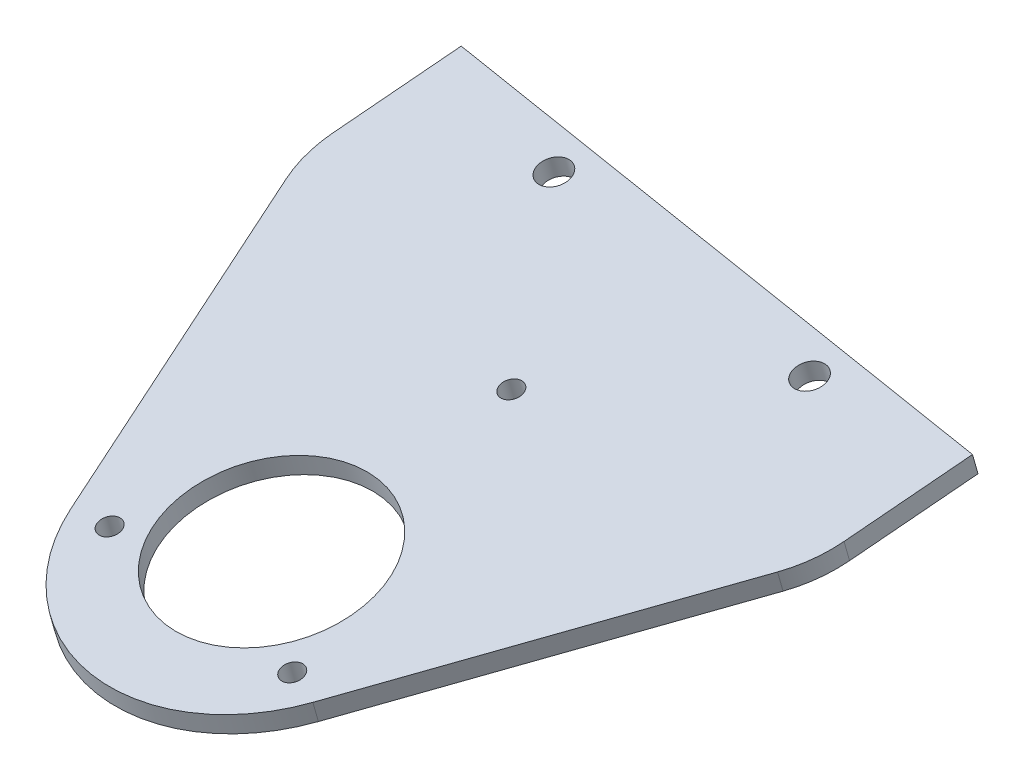
ISO-10303-21;
HEADER;
FILE_DESCRIPTION(('STEP AP214'),'2;1');
FILE_NAME('part.step','',(''),(''),'','','');
FILE_SCHEMA(('AUTOMOTIVE_DESIGN { 1 0 10303 214 1 1 1 1 }'));
ENDSEC;
DATA;
#1=APPLICATION_CONTEXT('core data for automotive mechanical design processes');
#2=APPLICATION_PROTOCOL_DEFINITION('international standard','automotive_design',2000,#1);
#3=PRODUCT_CONTEXT('',#1,'mechanical');
#4=PRODUCT('Part','Part','',(#3));
#5=PRODUCT_RELATED_PRODUCT_CATEGORY('part','',(#4));
#6=PRODUCT_DEFINITION_FORMATION('','',#4);
#7=PRODUCT_DEFINITION_CONTEXT('part definition',#1,'design');
#8=PRODUCT_DEFINITION('design','',#6,#7);
#9=PRODUCT_DEFINITION_SHAPE('','',#8);
#10=(LENGTH_UNIT() NAMED_UNIT(*) SI_UNIT(.MILLI.,.METRE.));
#11=(NAMED_UNIT(*) PLANE_ANGLE_UNIT() SI_UNIT($,.RADIAN.));
#12=(NAMED_UNIT(*) SI_UNIT($,.STERADIAN.) SOLID_ANGLE_UNIT());
#13=UNCERTAINTY_MEASURE_WITH_UNIT(LENGTH_MEASURE(1.E-05),#10,'distance_accuracy_value','');
#14=(GEOMETRIC_REPRESENTATION_CONTEXT(3) GLOBAL_UNCERTAINTY_ASSIGNED_CONTEXT((#13)) GLOBAL_UNIT_ASSIGNED_CONTEXT((#10,
#11,#12)) REPRESENTATION_CONTEXT('',''));
#15=CARTESIAN_POINT('',(0.,0.,0.));
#16=DIRECTION('',(0.,0.,1.));
#17=DIRECTION('',(1.,0.,0.));
#18=AXIS2_PLACEMENT_3D('',#15,#16,#17);
#19=CARTESIAN_POINT('',(-26.0581977589474,77.1039336245992,16.9247151772936));
#20=DIRECTION('',(-0.153827327877701,-0.249366025115355,0.95611387329971));
#21=DIRECTION('',(0.987303474445343,0.,0.158845363004883));
#22=AXIS2_PLACEMENT_3D('',#19,#20,#21);
#23=PLANE('',#22);
#24=DIRECTION('',(-0.987303474445343,0.,-0.158845363004883));
#25=VECTOR('',#24,1.);
#26=CARTESIAN_POINT('',(-26.1839615307256,80.1786331737241,17.7063999963345));
#27=LINE('',#26,#25);
#28=CARTESIAN_POINT('',(-26.1839615307256,80.1786331737241,17.7063999963345));
#29=VERTEX_POINT('',#28);
#30=CARTESIAN_POINT('',(-126.493994534372,80.1786331737242,1.56771111503845));
#31=VERTEX_POINT('',#30);
#32=EDGE_CURVE('E38',#29,#31,#27,.T.);
#33=ORIENTED_EDGE('',*,*,#32,.F.);
#34=DIRECTION('',(-0.0396106367805327,0.968409306811004,0.246199943005015));
#35=VECTOR('',#34,1.);
#36=CARTESIAN_POINT('',(-26.0581977589474,77.1039336245992,16.9247151772936));
#37=LINE('',#36,#35);
#38=CARTESIAN_POINT('',(-26.0581977589474,77.1039336245992,16.9247151772936));
#39=VERTEX_POINT('',#38);
#40=EDGE_CURVE('E169',#39,#29,#37,.T.);
#41=ORIENTED_EDGE('',*,*,#40,.F.);
#42=DIRECTION('',(-0.987303474445343,0.,-0.158845363004883));
#43=VECTOR('',#42,1.);
#44=CARTESIAN_POINT('',(-26.0581977589474,77.1039336245992,16.9247151772936));
#45=LINE('',#44,#43);
#46=CARTESIAN_POINT('',(-126.368230762594,77.1039336245993,0.786026295997527));
#47=VERTEX_POINT('',#46);
#48=EDGE_CURVE('E114',#39,#47,#45,.T.);
#49=ORIENTED_EDGE('',*,*,#48,.T.);
#50=DIRECTION('',(-0.0396106367805327,0.968409306811004,0.246199943005015));
#51=VECTOR('',#50,1.);
#52=CARTESIAN_POINT('',(-126.368230762594,77.1039336245993,0.786026295997527));
#53=LINE('',#52,#51);
#54=EDGE_CURVE('E126',#47,#31,#53,.T.);
#55=ORIENTED_EDGE('',*,*,#54,.T.);
#56=EDGE_LOOP('',(#33,#41,#49,#55));
#57=FACE_BOUND('',#56,.T.);
#58=ADVANCED_FACE('F34',(#57),#23,.F.);
#59=CARTESIAN_POINT('',(-126.368230762594,77.1039336245993,0.786026295997527));
#60=DIRECTION('',(0.987303474445343,0.,0.158845363004883));
#61=DIRECTION('',(-0.0396106367805327,0.968409306811004,0.246199943005015));
#62=AXIS2_PLACEMENT_3D('',#59,#60,#61);
#63=PLANE('',#62);
#64=DIRECTION('',(-0.153827327877701,-0.249366025115355,0.95611387329971));
#65=VECTOR('',#64,1.);
#66=CARTESIAN_POINT('',(-128.447601598419,77.0116846547592,13.7103573059448));
#67=LINE('',#66,#65);
#68=CARTESIAN_POINT('',(-129.424405130443,75.4282103952767,19.7816804013979));
#69=VERTEX_POINT('',#68);
#70=EDGE_CURVE('E51',#31,#69,#67,.T.);
#71=ORIENTED_EDGE('',*,*,#70,.F.);
#72=ORIENTED_EDGE('',*,*,#54,.F.);
#73=DIRECTION('',(0.153827327877701,0.249366025115355,-0.95611387329971));
#74=VECTOR('',#73,1.);
#75=CARTESIAN_POINT('',(-138.480594559684,57.4688528070162,76.0704326796167));
#76=LINE('',#75,#74);
#77=CARTESIAN_POINT('',(-129.298641358664,72.3535108461517,18.999995582357));
#78=VERTEX_POINT('',#77);
#79=EDGE_CURVE('E119',#78,#47,#76,.T.);
#80=ORIENTED_EDGE('',*,*,#79,.F.);
#81=DIRECTION('',(0.0396106367805327,-0.968409306811004,-0.246199943005015));
#82=VECTOR('',#81,1.);
#83=CARTESIAN_POINT('',(-133.574609599123,176.8932955164,45.5772794297483));
#84=LINE('',#83,#82);
#85=EDGE_CURVE('E104',#69,#78,#84,.T.);
#86=ORIENTED_EDGE('',*,*,#85,.F.);
#87=EDGE_LOOP('',(#71,#72,#80,#86));
#88=FACE_BOUND('',#87,.T.);
#89=ADVANCED_FACE('F125',(#88),#63,.F.);
#90=CARTESIAN_POINT('',(-114.766478410939,176.8932955164,48.6032835949914));
#91=DIRECTION('',(0.0396106367805327,-0.968409306811004,-0.246199943005015));
#92=DIRECTION('',(0.153827327877701,0.249366025115355,-0.95611387329971));
#93=AXIS2_PLACEMENT_3D('',#90,#91,#92);
#94=CYLINDRICAL_SURFACE('',#93,19.05);
#95=CARTESIAN_POINT('',(-110.616273942259,75.4282103952767,22.8076845666409));
#96=DIRECTION('',(0.0396106367805327,-0.968409306811004,-0.246199943005015));
#97=DIRECTION('',(0.153827327877701,0.249366025115355,-0.95611387329971));
#98=AXIS2_PLACEMENT_3D('',#95,#96,#97);
#99=CIRCLE('',#98,19.05);
#100=CARTESIAN_POINT('',(-128.787648504793,73.3322448306224,28.1284528250655));
#101=VERTEX_POINT('',#100);
#102=EDGE_CURVE('E111',#101,#69,#99,.T.);
#103=ORIENTED_EDGE('',*,*,#102,.T.);
#104=ORIENTED_EDGE('',*,*,#85,.T.);
#105=CARTESIAN_POINT('',(-110.490510170481,72.3535108461517,22.0259997476));
#106=DIRECTION('',(0.0396106367805327,-0.968409306811004,-0.246199943005015));
#107=DIRECTION('',(0.153827327877701,0.249366025115355,-0.95611387329971));
#108=AXIS2_PLACEMENT_3D('',#105,#106,#107);
#109=CIRCLE('',#108,19.05);
#110=CARTESIAN_POINT('',(-128.661884733015,70.2575452814975,27.3467680060246));
#111=VERTEX_POINT('',#110);
#112=EDGE_CURVE('E108',#111,#78,#109,.T.);
#113=ORIENTED_EDGE('',*,*,#112,.F.);
#114=DIRECTION('',(0.0396106367805327,-0.968409306811004,-0.246199943005015));
#115=VECTOR('',#114,1.);
#116=CARTESIAN_POINT('',(-132.937852973474,174.797329951745,53.9240518534159));
#117=LINE('',#116,#115);
#118=EDGE_CURVE('E187',#101,#111,#117,.T.);
#119=ORIENTED_EDGE('',*,*,#118,.F.);
#120=EDGE_LOOP('',(#103,#104,#113,#119));
#121=FACE_BOUND('',#120,.T.);
#122=ADVANCED_FACE('F106',(#121),#94,.T.);
#123=CARTESIAN_POINT('',(-26.0581977589474,77.1039336245992,16.9247151772936));
#124=DIRECTION('',(0.987303474445343,0.,0.158845363004883));
#125=DIRECTION('',(-0.0396106367805327,0.968409306811004,0.246199943005015));
#126=AXIS2_PLACEMENT_3D('',#123,#124,#125);
#127=PLANE('',#126);
#128=ORIENTED_EDGE('',*,*,#40,.T.);
#129=DIRECTION('',(-0.153827327877701,-0.249366025115355,0.95611387329971));
#130=VECTOR('',#129,1.);
#131=CARTESIAN_POINT('',(-28.1375685947724,77.0116846547591,29.8490461872409));
#132=LINE('',#131,#130);
#133=CARTESIAN_POINT('',(-29.1143721267958,75.4282103952766,35.920369282694));
#134=VERTEX_POINT('',#133);
#135=EDGE_CURVE('E59',#29,#134,#132,.T.);
#136=ORIENTED_EDGE('',*,*,#135,.T.);
#137=DIRECTION('',(0.0396106367805327,-0.968409306811004,-0.246199943005015));
#138=VECTOR('',#137,1.);
#139=CARTESIAN_POINT('',(-33.2645765954761,176.8932955164,61.7159683110444));
#140=LINE('',#139,#138);
#141=CARTESIAN_POINT('',(-28.9886083550176,72.3535108461517,35.1386844636531));
#142=VERTEX_POINT('',#141);
#143=EDGE_CURVE('E113',#134,#142,#140,.T.);
#144=ORIENTED_EDGE('',*,*,#143,.T.);
#145=DIRECTION('',(0.153827327877701,0.249366025115355,-0.95611387329971));
#146=VECTOR('',#145,1.);
#147=CARTESIAN_POINT('',(-38.1705615560376,57.4688528070161,92.2091215609128));
#148=LINE('',#147,#146);
#149=EDGE_CURVE('E135',#142,#39,#148,.T.);
#150=ORIENTED_EDGE('',*,*,#149,.T.);
#151=EDGE_LOOP('',(#128,#136,#144,#150));
#152=FACE_BOUND('',#151,.T.);
#153=ADVANCED_FACE('F171',(#152),#127,.T.);
#154=CARTESIAN_POINT('',(-52.0727077836599,176.8932955164,58.6899641458014));
#155=DIRECTION('',(0.0396106367805327,-0.968409306811004,-0.246199943005015));
#156=DIRECTION('',(0.153827327877701,0.249366025115355,-0.95611387329971));
#157=AXIS2_PLACEMENT_3D('',#154,#155,#156);
#158=CYLINDRICAL_SURFACE('',#157,19.05);
#159=CARTESIAN_POINT('',(-47.9225033149796,75.4282103952766,32.894365117451));
#160=DIRECTION('',(0.0396106367805327,-0.968409306811004,-0.246199943005015));
#161=DIRECTION('',(0.153827327877701,0.249366025115355,-0.95611387329971));
#162=AXIS2_PLACEMENT_3D('',#159,#160,#161);
#163=CIRCLE('',#162,19.05);
#164=CARTESIAN_POINT('',(-32.3370205713912,73.3322448306223,43.6462094244102));
#165=VERTEX_POINT('',#164);
#166=EDGE_CURVE('E127',#134,#165,#163,.T.);
#167=ORIENTED_EDGE('',*,*,#166,.T.);
#168=DIRECTION('',(0.0396106367805327,-0.968409306811004,-0.246199943005015));
#169=VECTOR('',#168,1.);
#170=CARTESIAN_POINT('',(-36.4872250400715,174.797329951745,69.4418084527606));
#171=LINE('',#170,#169);
#172=CARTESIAN_POINT('',(-32.211256799613,70.2575452814974,42.8645246053692));
#173=VERTEX_POINT('',#172);
#174=EDGE_CURVE('E123',#165,#173,#171,.T.);
#175=ORIENTED_EDGE('',*,*,#174,.T.);
#176=CARTESIAN_POINT('',(-47.7967395432014,72.3535108461517,32.1126802984101));
#177=DIRECTION('',(0.0396106367805327,-0.968409306811004,-0.246199943005015));
#178=DIRECTION('',(0.153827327877701,0.249366025115355,-0.95611387329971));
#179=AXIS2_PLACEMENT_3D('',#176,#177,#178);
#180=CIRCLE('',#179,19.05);
#181=EDGE_CURVE('E179',#142,#173,#180,.T.);
#182=ORIENTED_EDGE('',*,*,#181,.F.);
#183=ORIENTED_EDGE('',*,*,#143,.F.);
#184=EDGE_LOOP('',(#167,#175,#182,#183));
#185=FACE_BOUND('',#184,.T.);
#186=ADVANCED_FACE('F213',(#185),#158,.T.);
#187=CARTESIAN_POINT('',(-38.1705615560376,57.4688528070161,92.2091215609128));
#188=DIRECTION('',(-0.0396106367805327,0.968409306811004,0.246199943005015));
#189=DIRECTION('',(-0.153827327877701,-0.249366025115355,0.95611387329971));
#190=AXIS2_PLACEMENT_3D('',#187,#188,#189);
#191=PLANE('',#190);
#192=CARTESIAN_POINT('',(-51.9366849061183,75.8054847318236,17.8685278952412));
#193=DIRECTION('',(0.0396106367805332,-0.968409306811004,-0.246199943005015));
#194=DIRECTION('',(0.987303474445343,0.,0.158845363004883));
#195=AXIS2_PLACEMENT_3D('',#192,#193,#194);
#196=CIRCLE('',#195,2.48284999999999);
#197=CARTESIAN_POINT('',(-49.4853584745917,75.8054847318236,18.2629171047779));
#198=VERTEX_POINT('',#197);
#199=EDGE_CURVE('E204',#198,#198,#196,.T.);
#200=ORIENTED_EDGE('',*,*,#199,.F.);
#201=EDGE_LOOP('',(#200));
#202=FACE_BOUND('',#201,.T.);
#203=CARTESIAN_POINT('',(-86.3719709938142,60.6358013259812,71.9971309293585));
#204=DIRECTION('',(-0.0396106367805327,0.968409306811004,0.246199943005014));
#205=DIRECTION('',(-0.153827327877701,-0.249366025115355,0.95611387329971));
#206=AXIS2_PLACEMENT_3D('',#203,#204,#205);
#207=CIRCLE('',#206,15.8369);
#208=CARTESIAN_POINT('',(-88.8081190026806,56.6866165228318,87.1390107294186));
#209=VERTEX_POINT('',#208);
#210=EDGE_CURVE('E161',#209,#209,#207,.T.);
#211=ORIENTED_EDGE('',*,*,#210,.T.);
#212=EDGE_LOOP('',(#211));
#213=FACE_BOUND('',#212,.T.);
#214=CARTESIAN_POINT('',(-105.900322591517,58.0230687978351,79.1322424690456));
#215=DIRECTION('',(0.0396106367805327,-0.968409306811004,-0.246199943005015));
#216=DIRECTION('',(0.153827327877701,0.249366025115355,-0.95611387329971));
#217=AXIS2_PLACEMENT_3D('',#214,#215,#216);
#218=CIRCLE('',#217,1.7272);
#219=CARTESIAN_POINT('',(-105.634632030806,58.4537737964143,77.4808425870824));
#220=VERTEX_POINT('',#219);
#221=EDGE_CURVE('E151',#220,#220,#218,.T.);
#222=ORIENTED_EDGE('',*,*,#221,.F.);
#223=EDGE_LOOP('',(#222));
#224=FACE_BOUND('',#223,.T.);
#225=CARTESIAN_POINT('',(-70.067071051789,58.023068797835,84.8973856046666));
#226=DIRECTION('',(0.0396106367805327,-0.968409306811004,-0.246199943005015));
#227=DIRECTION('',(0.153827327877701,0.249366025115355,-0.95611387329971));
#228=AXIS2_PLACEMENT_3D('',#225,#226,#227);
#229=CIRCLE('',#228,1.7272);
#230=CARTESIAN_POINT('',(-69.8013804910786,58.4537737964143,83.2459857227034));
#231=VERTEX_POINT('',#230);
#232=EDGE_CURVE('E194',#231,#231,#229,.T.);
#233=ORIENTED_EDGE('',*,*,#232,.F.);
#234=EDGE_LOOP('',(#233));
#235=FACE_BOUND('',#234,.T.);
#236=CARTESIAN_POINT('',(-80.9019917328548,69.5030618094587,37.9984706768511));
#237=DIRECTION('',(0.0396106367805327,-0.968409306811004,-0.246199943005015));
#238=DIRECTION('',(0.153827327877701,0.249366025115355,-0.95611387329971));
#239=AXIS2_PLACEMENT_3D('',#236,#237,#238);
#240=CIRCLE('',#239,1.72720000000001);
#241=CARTESIAN_POINT('',(-80.6363011721445,69.9337668080379,36.3470707948878));
#242=VERTEX_POINT('',#241);
#243=EDGE_CURVE('E160',#242,#242,#240,.T.);
#244=ORIENTED_EDGE('',*,*,#243,.F.);
#245=EDGE_LOOP('',(#244));
#246=FACE_BOUND('',#245,.T.);
#247=CARTESIAN_POINT('',(-86.3719709938142,60.6358013259812,71.9971309293584));
#248=DIRECTION('',(0.0396106367805327,-0.968409306811004,-0.246199943005015));
#249=DIRECTION('',(0.153827327877701,0.249366025115355,-0.95611387329971));
#250=AXIS2_PLACEMENT_3D('',#247,#248,#249);
#251=CIRCLE('',#250,26.8097);
#252=CARTESIAN_POINT('',(-64.4380016126708,57.6860791213244,87.1285598173523));
#253=VERTEX_POINT('',#252);
#254=CARTESIAN_POINT('',(-111.945152128154,57.6860791213244,79.4852254583813));
#255=VERTEX_POINT('',#254);
#256=EDGE_CURVE('E157',#253,#255,#251,.T.);
#257=ORIENTED_EDGE('',*,*,#256,.T.);
#258=DIRECTION('',(0.297569979181168,-0.2237812263906,0.928102402865782));
#259=VECTOR('',#258,1.);
#260=CARTESIAN_POINT('',(-136.250115246746,75.9641139856724,3.67954528190292));
#261=LINE('',#260,#259);
#262=EDGE_CURVE('E122',#111,#255,#261,.T.);
#263=ORIENTED_EDGE('',*,*,#262,.F.);
#264=ORIENTED_EDGE('',*,*,#112,.T.);
#265=ORIENTED_EDGE('',*,*,#79,.T.);
#266=ORIENTED_EDGE('',*,*,#48,.F.);
#267=ORIENTED_EDGE('',*,*,#149,.F.);
#268=ORIENTED_EDGE('',*,*,#181,.T.);
#269=DIRECTION('',(-0.573659459044647,-0.223781226390599,0.787931968994609));
#270=VECTOR('',#269,1.);
#271=CARTESIAN_POINT('',(-43.2983453672571,65.9325363626163,58.0928475900017));
#272=LINE('',#271,#270);
#273=EDGE_CURVE('E183',#173,#253,#272,.T.);
#274=ORIENTED_EDGE('',*,*,#273,.T.);
#275=EDGE_LOOP('',(#257,#263,#264,#265,#266,#267,#268,#274));
#276=FACE_BOUND('',#275,.T.);
#277=CARTESIAN_POINT('',(-102.091701407942,75.8054847318236,9.79918345459314));
#278=DIRECTION('',(0.0396106367805332,-0.968409306811004,-0.246199943005015));
#279=DIRECTION('',(0.987303474445343,0.,0.158845363004883));
#280=AXIS2_PLACEMENT_3D('',#277,#278,#279);
#281=CIRCLE('',#280,2.48284999999999);
#282=CARTESIAN_POINT('',(-99.6403749764151,75.8054847318236,10.1935726641298));
#283=VERTEX_POINT('',#282);
#284=EDGE_CURVE('E201',#283,#283,#281,.T.);
#285=ORIENTED_EDGE('',*,*,#284,.F.);
#286=EDGE_LOOP('',(#285));
#287=FACE_BOUND('',#286,.T.);
#288=ADVANCED_FACE('F36',(#202,#213,#224,#235,#246,#276,#287),#191,.F.);
#289=CARTESIAN_POINT('',(-51.9366849061183,75.8054847318236,17.8685278952412));
#290=DIRECTION('',(0.0396106367805332,-0.968409306811004,-0.246199943005015));
#291=DIRECTION('',(0.987303474445343,0.,0.158845363004883));
#292=AXIS2_PLACEMENT_3D('',#289,#290,#291);
#293=CYLINDRICAL_SURFACE('',#292,2.48284999999999);
#294=ORIENTED_EDGE('',*,*,#199,.T.);
#295=EDGE_LOOP('',(#294));
#296=FACE_BOUND('',#295,.T.);
#297=CARTESIAN_POINT('',(-52.0624486778965,78.8801842809485,18.6502127142821));
#298=DIRECTION('',(-0.0396106367805327,0.968409306811004,0.246199943005015));
#299=DIRECTION('',(0.153827327877806,0.249366025115355,-0.956113873299693));
#300=AXIS2_PLACEMENT_3D('',#297,#298,#299);
#301=CIRCLE('',#300,2.48284999999999);
#302=CARTESIAN_POINT('',(-51.6805184968751,79.4993227164062,16.27632538396));
#303=VERTEX_POINT('',#302);
#304=EDGE_CURVE('E11',#303,#303,#301,.F.);
#305=ORIENTED_EDGE('',*,*,#304,.F.);
#306=EDGE_LOOP('',(#305));
#307=FACE_BOUND('',#306,.T.);
#308=ADVANCED_FACE('F208',(#296,#307),#293,.F.);
#309=CARTESIAN_POINT('',(-102.091701407942,75.8054847318236,9.79918345459314));
#310=DIRECTION('',(0.0396106367805332,-0.968409306811004,-0.246199943005015));
#311=DIRECTION('',(0.987303474445343,0.,0.158845363004883));
#312=AXIS2_PLACEMENT_3D('',#309,#310,#311);
#313=CYLINDRICAL_SURFACE('',#312,2.48284999999999);
#314=ORIENTED_EDGE('',*,*,#284,.T.);
#315=EDGE_LOOP('',(#314));
#316=FACE_BOUND('',#315,.T.);
#317=CARTESIAN_POINT('',(-102.21746517972,78.8801842809485,10.5808682736341));
#318=DIRECTION('',(-0.0396106367805327,0.968409306811004,0.246199943005015));
#319=DIRECTION('',(0.153827327877806,0.249366025115355,-0.956113873299693));
#320=AXIS2_PLACEMENT_3D('',#317,#318,#319);
#321=CIRCLE('',#320,2.48284999999999);
#322=CARTESIAN_POINT('',(-101.835534998699,79.4993227164062,8.20698094331194));
#323=VERTEX_POINT('',#322);
#324=EDGE_CURVE('E43',#323,#323,#321,.F.);
#325=ORIENTED_EDGE('',*,*,#324,.F.);
#326=EDGE_LOOP('',(#325));
#327=FACE_BOUND('',#326,.T.);
#328=ADVANCED_FACE('F299',(#316,#327),#313,.F.);
#329=CARTESIAN_POINT('',(-86.3719709938142,60.6358013259812,71.9971309293585));
#330=DIRECTION('',(-0.0396106367805327,0.968409306811004,0.246199943005014));
#331=DIRECTION('',(-0.153827327877701,-0.249366025115355,0.95611387329971));
#332=AXIS2_PLACEMENT_3D('',#329,#330,#331);
#333=CYLINDRICAL_SURFACE('',#332,15.8369);
#334=ORIENTED_EDGE('',*,*,#210,.F.);
#335=EDGE_LOOP('',(#334));
#336=FACE_BOUND('',#335,.T.);
#337=CARTESIAN_POINT('',(-86.4977347655924,63.7105008751061,72.7788157483994));
#338=DIRECTION('',(0.0396106367805327,-0.968409306811004,-0.246199943005015));
#339=DIRECTION('',(0.153827327877701,0.249366025115355,-0.95611387329971));
#340=AXIS2_PLACEMENT_3D('',#337,#338,#339);
#341=CIRCLE('',#340,15.8369);
#342=CARTESIAN_POINT('',(-84.0615867567261,67.6596856782555,57.6369359483392));
#343=VERTEX_POINT('',#342);
#344=EDGE_CURVE('E158',#343,#343,#341,.T.);
#345=ORIENTED_EDGE('',*,*,#344,.F.);
#346=EDGE_LOOP('',(#345));
#347=FACE_BOUND('',#346,.T.);
#348=ADVANCED_FACE('F291',(#336,#347),#333,.F.);
#349=CARTESIAN_POINT('',(-110.176290831975,162.562853468083,105.709526316437));
#350=DIRECTION('',(0.0396106367805327,-0.968409306811004,-0.246199943005015));
#351=DIRECTION('',(0.153827327877701,0.249366025115355,-0.95611387329971));
#352=AXIS2_PLACEMENT_3D('',#349,#350,#351);
#353=CYLINDRICAL_SURFACE('',#352,1.7272);
#354=ORIENTED_EDGE('',*,*,#221,.T.);
#355=EDGE_LOOP('',(#354));
#356=FACE_BOUND('',#355,.T.);
#357=CARTESIAN_POINT('',(-106.026086363295,61.09776834696,79.9139272880866));
#358=DIRECTION('',(0.0396106367805327,-0.968409306811004,-0.246199943005015));
#359=DIRECTION('',(0.153827327877701,0.249366025115355,-0.95611387329971));
#360=AXIS2_PLACEMENT_3D('',#357,#358,#359);
#361=CIRCLE('',#360,1.7272);
#362=CARTESIAN_POINT('',(-105.760395802585,61.5284733455393,78.2625274061233));
#363=VERTEX_POINT('',#362);
#364=EDGE_CURVE('E154',#363,#363,#361,.T.);
#365=ORIENTED_EDGE('',*,*,#364,.F.);
#366=EDGE_LOOP('',(#365));
#367=FACE_BOUND('',#366,.T.);
#368=ADVANCED_FACE('F283',(#356,#367),#353,.F.);
#369=CARTESIAN_POINT('',(-74.3430392922475,162.562853468083,111.474669452058));
#370=DIRECTION('',(0.0396106367805327,-0.968409306811004,-0.246199943005015));
#371=DIRECTION('',(0.153827327877701,0.249366025115355,-0.95611387329971));
#372=AXIS2_PLACEMENT_3D('',#369,#370,#371);
#373=CYLINDRICAL_SURFACE('',#372,1.7272);
#374=ORIENTED_EDGE('',*,*,#232,.T.);
#375=EDGE_LOOP('',(#374));
#376=FACE_BOUND('',#375,.T.);
#377=CARTESIAN_POINT('',(-70.1928348235672,61.09776834696,85.6790704237076));
#378=DIRECTION('',(0.0396106367805327,-0.968409306811004,-0.246199943005015));
#379=DIRECTION('',(0.153827327877701,0.249366025115355,-0.95611387329971));
#380=AXIS2_PLACEMENT_3D('',#377,#378,#379);
#381=CIRCLE('',#380,1.7272);
#382=CARTESIAN_POINT('',(-69.9271442628568,61.5284733455392,84.0276705417443));
#383=VERTEX_POINT('',#382);
#384=EDGE_CURVE('E150',#383,#383,#381,.T.);
#385=ORIENTED_EDGE('',*,*,#384,.F.);
#386=EDGE_LOOP('',(#385));
#387=FACE_BOUND('',#386,.T.);
#388=ADVANCED_FACE('F226',(#376,#387),#373,.F.);
#389=CARTESIAN_POINT('',(-85.1779599733133,174.042846479707,64.5757545242424));
#390=DIRECTION('',(0.0396106367805327,-0.968409306811004,-0.246199943005015));
#391=DIRECTION('',(0.153827327877701,0.249366025115355,-0.95611387329971));
#392=AXIS2_PLACEMENT_3D('',#389,#390,#391);
#393=CYLINDRICAL_SURFACE('',#392,1.72720000000001);
#394=ORIENTED_EDGE('',*,*,#243,.T.);
#395=EDGE_LOOP('',(#394));
#396=FACE_BOUND('',#395,.T.);
#397=CARTESIAN_POINT('',(-81.027755504633,72.5777613585837,38.780155495892));
#398=DIRECTION('',(0.0396106367805327,-0.968409306811004,-0.246199943005015));
#399=DIRECTION('',(0.153827327877701,0.249366025115355,-0.95611387329971));
#400=AXIS2_PLACEMENT_3D('',#397,#398,#399);
#401=CIRCLE('',#400,1.72720000000001);
#402=CARTESIAN_POINT('',(-80.7620649439226,73.0084663571629,37.1287556139287));
#403=VERTEX_POINT('',#402);
#404=EDGE_CURVE('E147',#403,#403,#401,.T.);
#405=ORIENTED_EDGE('',*,*,#404,.F.);
#406=EDGE_LOOP('',(#405));
#407=FACE_BOUND('',#406,.T.);
#408=ADVANCED_FACE('F222',(#396,#407),#393,.F.);
#409=CARTESIAN_POINT('',(-140.526083487204,180.50389865592,30.2568291292943));
#410=DIRECTION('',(0.953877929791836,0.110024439089463,-0.27930542038974));
#411=DIRECTION('',(-0.297569979181168,0.2237812263906,-0.928102402865782));
#412=AXIS2_PLACEMENT_3D('',#409,#410,#411);
#413=PLANE('',#412);
#414=ORIENTED_EDGE('',*,*,#118,.T.);
#415=ORIENTED_EDGE('',*,*,#262,.T.);
#416=DIRECTION('',(0.0396106367805327,-0.968409306811004,-0.246199943005015));
#417=VECTOR('',#416,1.);
#418=CARTESIAN_POINT('',(-116.221120368613,162.225863791572,106.062509305773));
#419=LINE('',#418,#417);
#420=CARTESIAN_POINT('',(-112.070915899933,60.7607786704493,80.2669102774222));
#421=VERTEX_POINT('',#420);
#422=EDGE_CURVE('E176',#421,#255,#419,.T.);
#423=ORIENTED_EDGE('',*,*,#422,.F.);
#424=DIRECTION('',(0.297569979181168,-0.2237812263906,0.928102402865782));
#425=VECTOR('',#424,1.);
#426=CARTESIAN_POINT('',(-119.645126479043,66.4568039785067,56.64341486425));
#427=LINE('',#426,#425);
#428=EDGE_CURVE('E139',#101,#421,#427,.T.);
#429=ORIENTED_EDGE('',*,*,#428,.F.);
#430=EDGE_LOOP('',(#414,#415,#423,#429));
#431=FACE_BOUND('',#430,.T.);
#432=ADVANCED_FACE('F225',(#431),#413,.F.);
#433=CARTESIAN_POINT('',(-47.5743136077156,170.472321032864,84.670131437393));
#434=DIRECTION('',(0.818135577091257,-0.110024439089464,0.564401275955862));
#435=DIRECTION('',(0.573659459044647,0.223781226390599,-0.78793196899461));
#436=AXIS2_PLACEMENT_3D('',#433,#434,#435);
#437=PLANE('',#436);
#438=DIRECTION('',(-0.573659459044647,-0.223781226390599,0.78793196899461));
#439=VECTOR('',#438,1.);
#440=CARTESIAN_POINT('',(-24.2463163515104,76.4883816015626,32.5334762409632));
#441=LINE('',#440,#439);
#442=CARTESIAN_POINT('',(-64.563765384449,60.7607786704493,87.9102446363933));
#443=VERTEX_POINT('',#442);
#444=EDGE_CURVE('E144',#165,#443,#441,.T.);
#445=ORIENTED_EDGE('',*,*,#444,.T.);
#446=DIRECTION('',(0.0396106367805327,-0.968409306811004,-0.246199943005015));
#447=VECTOR('',#446,1.);
#448=CARTESIAN_POINT('',(-68.7139698531293,162.225863791572,113.705843664744));
#449=LINE('',#448,#447);
#450=EDGE_CURVE('E177',#443,#253,#449,.T.);
#451=ORIENTED_EDGE('',*,*,#450,.T.);
#452=ORIENTED_EDGE('',*,*,#273,.F.);
#453=ORIENTED_EDGE('',*,*,#174,.F.);
#454=EDGE_LOOP('',(#445,#451,#452,#453));
#455=FACE_BOUND('',#454,.T.);
#456=ADVANCED_FACE('F237',(#455),#437,.T.);
#457=CARTESIAN_POINT('',(-90.6479392342728,165.175585996229,98.5744147767498));
#458=DIRECTION('',(0.0396106367805327,-0.968409306811004,-0.246199943005015));
#459=DIRECTION('',(0.153827327877701,0.249366025115355,-0.95611387329971));
#460=AXIS2_PLACEMENT_3D('',#457,#458,#459);
#461=CYLINDRICAL_SURFACE('',#460,26.8097);
#462=ORIENTED_EDGE('',*,*,#450,.F.);
#463=CARTESIAN_POINT('',(-86.4977347655924,63.7105008751061,72.7788157483994));
#464=DIRECTION('',(0.0396106367805327,-0.968409306811004,-0.246199943005015));
#465=DIRECTION('',(0.153827327877701,0.249366025115355,-0.95611387329971));
#466=AXIS2_PLACEMENT_3D('',#463,#464,#465);
#467=CIRCLE('',#466,26.8097);
#468=EDGE_CURVE('E142',#443,#421,#467,.T.);
#469=ORIENTED_EDGE('',*,*,#468,.T.);
#470=ORIENTED_EDGE('',*,*,#422,.T.);
#471=ORIENTED_EDGE('',*,*,#256,.F.);
#472=EDGE_LOOP('',(#462,#469,#470,#471));
#473=FACE_BOUND('',#472,.T.);
#474=ADVANCED_FACE('F231',(#473),#461,.T.);
#475=CARTESIAN_POINT('',(-28.1375685947724,77.0116846547591,29.8490461872409));
#476=DIRECTION('',(0.0396106367805327,-0.968409306811004,-0.246199943005015));
#477=DIRECTION('',(0.153827327877701,0.249366025115355,-0.95611387329971));
#478=AXIS2_PLACEMENT_3D('',#475,#476,#477);
#479=PLANE('',#478);
#480=ORIENTED_EDGE('',*,*,#344,.T.);
#481=EDGE_LOOP('',(#480));
#482=FACE_BOUND('',#481,.T.);
#483=ORIENTED_EDGE('',*,*,#364,.T.);
#484=EDGE_LOOP('',(#483));
#485=FACE_BOUND('',#484,.T.);
#486=ORIENTED_EDGE('',*,*,#384,.T.);
#487=EDGE_LOOP('',(#486));
#488=FACE_BOUND('',#487,.T.);
#489=ORIENTED_EDGE('',*,*,#404,.T.);
#490=EDGE_LOOP('',(#489));
#491=FACE_BOUND('',#490,.T.);
#492=ORIENTED_EDGE('',*,*,#468,.F.);
#493=ORIENTED_EDGE('',*,*,#444,.F.);
#494=ORIENTED_EDGE('',*,*,#166,.F.);
#495=ORIENTED_EDGE('',*,*,#135,.F.);
#496=ORIENTED_EDGE('',*,*,#32,.T.);
#497=ORIENTED_EDGE('',*,*,#70,.T.);
#498=ORIENTED_EDGE('',*,*,#102,.F.);
#499=ORIENTED_EDGE('',*,*,#428,.T.);
#500=EDGE_LOOP('',(#492,#493,#494,#495,#496,#497,#498,#499));
#501=FACE_BOUND('',#500,.T.);
#502=ORIENTED_EDGE('',*,*,#324,.T.);
#503=EDGE_LOOP('',(#502));
#504=FACE_BOUND('',#503,.T.);
#505=ORIENTED_EDGE('',*,*,#304,.T.);
#506=EDGE_LOOP('',(#505));
#507=FACE_BOUND('',#506,.T.);
#508=ADVANCED_FACE('F165',(#482,#485,#488,#491,#501,#504,#507),#479,.F.);
#509=CLOSED_SHELL('',(#58,#89,#122,#153,#186,#288,#308,#328,#348,#368,#388,#408,#432,#456,#474,#508));
#510=MANIFOLD_SOLID_BREP('B2',#509);
#511=ADVANCED_BREP_SHAPE_REPRESENTATION('',(#18,#510),#14);
#512=SHAPE_DEFINITION_REPRESENTATION(#9,#511);
ENDSEC;
END-ISO-10303-21;
